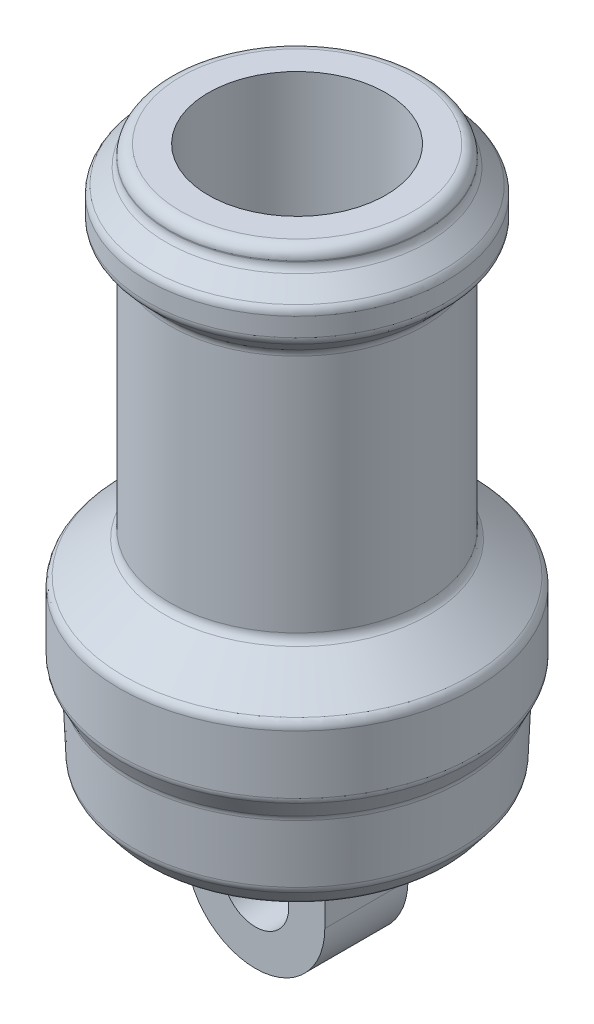
ISO-10303-21;
HEADER;
FILE_DESCRIPTION(('STEP AP214'),'2;1');
FILE_NAME('part.step','',(''),(''),'','','');
FILE_SCHEMA(('AUTOMOTIVE_DESIGN { 1 0 10303 214 1 1 1 1 }'));
ENDSEC;
DATA;
#1=APPLICATION_CONTEXT('core data for automotive mechanical design processes');
#2=APPLICATION_PROTOCOL_DEFINITION('international standard','automotive_design',2000,#1);
#3=PRODUCT_CONTEXT('',#1,'mechanical');
#4=PRODUCT('Part','Part','',(#3));
#5=PRODUCT_RELATED_PRODUCT_CATEGORY('part','',(#4));
#6=PRODUCT_DEFINITION_FORMATION('','',#4);
#7=PRODUCT_DEFINITION_CONTEXT('part definition',#1,'design');
#8=PRODUCT_DEFINITION('design','',#6,#7);
#9=PRODUCT_DEFINITION_SHAPE('','',#8);
#10=(LENGTH_UNIT() NAMED_UNIT(*) SI_UNIT(.MILLI.,.METRE.));
#11=(NAMED_UNIT(*) PLANE_ANGLE_UNIT() SI_UNIT($,.RADIAN.));
#12=(NAMED_UNIT(*) SI_UNIT($,.STERADIAN.) SOLID_ANGLE_UNIT());
#13=UNCERTAINTY_MEASURE_WITH_UNIT(LENGTH_MEASURE(1.E-05),#10,'distance_accuracy_value','');
#14=(GEOMETRIC_REPRESENTATION_CONTEXT(3) GLOBAL_UNCERTAINTY_ASSIGNED_CONTEXT((#13)) GLOBAL_UNIT_ASSIGNED_CONTEXT((#10,
#11,#12)) REPRESENTATION_CONTEXT('',''));
#15=CARTESIAN_POINT('',(0.,0.,0.));
#16=DIRECTION('',(0.,0.,1.));
#17=DIRECTION('',(1.,0.,0.));
#18=AXIS2_PLACEMENT_3D('',#15,#16,#17);
#19=CARTESIAN_POINT('',(-12.5,-75.,7.5));
#20=DIRECTION('',(0.,0.,-1.));
#21=DIRECTION('',(-1.,0.,0.));
#22=AXIS2_PLACEMENT_3D('',#19,#20,#21);
#23=PLANE('',#22);
#24=CARTESIAN_POINT('',(0.,-62.5,7.5));
#25=DIRECTION('',(0.,0.,-1.));
#26=DIRECTION('',(-1.,0.,0.));
#27=AXIS2_PLACEMENT_3D('',#24,#25,#26);
#28=CIRCLE('',#27,6.00000000000001);
#29=CARTESIAN_POINT('',(-6.00000000000001,-62.5,7.5));
#30=VERTEX_POINT('',#29);
#31=EDGE_CURVE('E99',#30,#30,#28,.T.);
#32=ORIENTED_EDGE('',*,*,#31,.T.);
#33=EDGE_LOOP('',(#32));
#34=FACE_BOUND('',#33,.T.);
#35=DIRECTION('',(0.,1.,0.));
#36=VECTOR('',#35,1.);
#37=CARTESIAN_POINT('',(12.5,-75.,7.5));
#38=LINE('',#37,#36);
#39=CARTESIAN_POINT('',(12.5,-62.5,7.5));
#40=VERTEX_POINT('',#39);
#41=CARTESIAN_POINT('',(12.5,-52.,7.5));
#42=VERTEX_POINT('',#41);
#43=EDGE_CURVE('E103',#40,#42,#38,.T.);
#44=ORIENTED_EDGE('',*,*,#43,.T.);
#45=DIRECTION('',(-1.,0.,0.));
#46=VECTOR('',#45,1.);
#47=CARTESIAN_POINT('',(-12.5,-52.,7.5));
#48=LINE('',#47,#46);
#49=CARTESIAN_POINT('',(-12.5,-52.,7.5));
#50=VERTEX_POINT('',#49);
#51=EDGE_CURVE('E134',#42,#50,#48,.T.);
#52=ORIENTED_EDGE('',*,*,#51,.T.);
#53=DIRECTION('',(0.,1.,0.));
#54=VECTOR('',#53,1.);
#55=CARTESIAN_POINT('',(-12.5,-75.,7.5));
#56=LINE('',#55,#54);
#57=CARTESIAN_POINT('',(-12.5,-62.5,7.5));
#58=VERTEX_POINT('',#57);
#59=EDGE_CURVE('E109',#58,#50,#56,.T.);
#60=ORIENTED_EDGE('',*,*,#59,.F.);
#61=CARTESIAN_POINT('',(0.,-62.5,7.5));
#62=DIRECTION('',(0.,0.,-1.));
#63=DIRECTION('',(-1.,0.,0.));
#64=AXIS2_PLACEMENT_3D('',#61,#62,#63);
#65=CIRCLE('',#64,12.5);
#66=EDGE_CURVE('E107',#58,#40,#65,.F.);
#67=ORIENTED_EDGE('',*,*,#66,.T.);
#68=EDGE_LOOP('',(#44,#52,#60,#67));
#69=FACE_BOUND('',#68,.T.);
#70=ADVANCED_FACE('F36',(#34,#69),#23,.F.);
#71=CARTESIAN_POINT('',(-12.5,-75.,-7.5));
#72=DIRECTION('',(0.,0.,1.));
#73=DIRECTION('',(1.,0.,0.));
#74=AXIS2_PLACEMENT_3D('',#71,#72,#73);
#75=PLANE('',#74);
#76=CARTESIAN_POINT('',(0.,-62.5,-7.5));
#77=DIRECTION('',(0.,0.,-1.));
#78=DIRECTION('',(-1.,0.,0.));
#79=AXIS2_PLACEMENT_3D('',#76,#77,#78);
#80=CIRCLE('',#79,6.00000000000001);
#81=CARTESIAN_POINT('',(-6.00000000000001,-62.5,-7.5));
#82=VERTEX_POINT('',#81);
#83=EDGE_CURVE('E149',#82,#82,#80,.T.);
#84=ORIENTED_EDGE('',*,*,#83,.F.);
#85=EDGE_LOOP('',(#84));
#86=FACE_BOUND('',#85,.T.);
#87=DIRECTION('',(0.,1.,0.));
#88=VECTOR('',#87,1.);
#89=CARTESIAN_POINT('',(-12.5,-75.,-7.5));
#90=LINE('',#89,#88);
#91=CARTESIAN_POINT('',(-12.5,-62.5,-7.5));
#92=VERTEX_POINT('',#91);
#93=CARTESIAN_POINT('',(-12.5,-52.,-7.5));
#94=VERTEX_POINT('',#93);
#95=EDGE_CURVE('E106',#92,#94,#90,.T.);
#96=ORIENTED_EDGE('',*,*,#95,.T.);
#97=DIRECTION('',(1.,0.,0.));
#98=VECTOR('',#97,1.);
#99=CARTESIAN_POINT('',(12.5,-52.,-7.5));
#100=LINE('',#99,#98);
#101=CARTESIAN_POINT('',(12.5,-52.,-7.5));
#102=VERTEX_POINT('',#101);
#103=EDGE_CURVE('E51',#94,#102,#100,.T.);
#104=ORIENTED_EDGE('',*,*,#103,.T.);
#105=DIRECTION('',(0.,1.,0.));
#106=VECTOR('',#105,1.);
#107=CARTESIAN_POINT('',(12.5,-75.,-7.5));
#108=LINE('',#107,#106);
#109=CARTESIAN_POINT('',(12.5,-62.5,-7.5));
#110=VERTEX_POINT('',#109);
#111=EDGE_CURVE('E102',#110,#102,#108,.T.);
#112=ORIENTED_EDGE('',*,*,#111,.F.);
#113=CARTESIAN_POINT('',(0.,-62.5,-7.5));
#114=DIRECTION('',(0.,0.,1.));
#115=DIRECTION('',(1.,0.,0.));
#116=AXIS2_PLACEMENT_3D('',#113,#114,#115);
#117=CIRCLE('',#116,12.5);
#118=EDGE_CURVE('E92',#92,#110,#117,.T.);
#119=ORIENTED_EDGE('',*,*,#118,.F.);
#120=EDGE_LOOP('',(#96,#104,#112,#119));
#121=FACE_BOUND('',#120,.T.);
#122=ADVANCED_FACE('F105',(#86,#121),#75,.F.);
#123=CARTESIAN_POINT('',(0.,-50.,0.));
#124=DIRECTION('',(0.,1.,0.));
#125=DIRECTION('',(0.,0.,1.));
#126=AXIS2_PLACEMENT_3D('',#123,#124,#125);
#127=PLANE('',#126);
#128=CARTESIAN_POINT('',(0.,-50.,0.));
#129=DIRECTION('',(0.,1.,0.));
#130=DIRECTION('',(0.,0.,1.));
#131=AXIS2_PLACEMENT_3D('',#128,#129,#130);
#132=CIRCLE('',#131,25.2591487847459);
#133=CARTESIAN_POINT('',(0.,-50.,25.2591487847459));
#134=VERTEX_POINT('',#133);
#135=EDGE_CURVE('E138',#134,#134,#132,.F.);
#136=ORIENTED_EDGE('',*,*,#135,.T.);
#137=EDGE_LOOP('',(#136));
#138=FACE_BOUND('',#137,.T.);
#139=DIRECTION('',(1.,0.,0.));
#140=VECTOR('',#139,1.);
#141=CARTESIAN_POINT('',(-12.5,-50.,-9.5));
#142=LINE('',#141,#140);
#143=CARTESIAN_POINT('',(14.5,-50.,-9.5));
#144=VERTEX_POINT('',#143);
#145=CARTESIAN_POINT('',(-14.5,-50.,-9.5));
#146=VERTEX_POINT('',#145);
#147=EDGE_CURVE('E125',#144,#146,#142,.F.);
#148=ORIENTED_EDGE('',*,*,#147,.T.);
#149=DIRECTION('',(0.,0.,-1.));
#150=VECTOR('',#149,1.);
#151=CARTESIAN_POINT('',(-14.5,-50.,7.5));
#152=LINE('',#151,#150);
#153=CARTESIAN_POINT('',(-14.5,-50.,9.5));
#154=VERTEX_POINT('',#153);
#155=EDGE_CURVE('E131',#146,#154,#152,.F.);
#156=ORIENTED_EDGE('',*,*,#155,.T.);
#157=DIRECTION('',(-1.,0.,0.));
#158=VECTOR('',#157,1.);
#159=CARTESIAN_POINT('',(12.5,-50.,9.5));
#160=LINE('',#159,#158);
#161=CARTESIAN_POINT('',(14.5,-50.,9.5));
#162=VERTEX_POINT('',#161);
#163=EDGE_CURVE('E129',#154,#162,#160,.F.);
#164=ORIENTED_EDGE('',*,*,#163,.T.);
#165=DIRECTION('',(0.,0.,1.));
#166=VECTOR('',#165,1.);
#167=CARTESIAN_POINT('',(14.5,-50.,-7.5));
#168=LINE('',#167,#166);
#169=EDGE_CURVE('E127',#162,#144,#168,.F.);
#170=ORIENTED_EDGE('',*,*,#169,.T.);
#171=EDGE_LOOP('',(#148,#156,#164,#170));
#172=FACE_BOUND('',#171,.T.);
#173=ADVANCED_FACE('F229',(#138,#172),#127,.F.);
#174=CARTESIAN_POINT('',(0.,-45.8822419738754,0.));
#175=DIRECTION('',(0.,1.,0.));
#176=DIRECTION('',(0.,0.,1.));
#177=AXIS2_PLACEMENT_3D('',#174,#175,#176);
#178=CONICAL_SURFACE('',#177,29.4400170830632,0.661043168850687);
#179=CARTESIAN_POINT('',(0.,-49.2278812270298,0.));
#180=DIRECTION('',(0.,-1.,0.));
#181=DIRECTION('',(0.,0.,-1.));
#182=AXIS2_PLACEMENT_3D('',#179,#180,#181);
#183=CIRCLE('',#182,26.8378532194986);
#184=CARTESIAN_POINT('',(0.,-49.2278812270298,-26.8378532194986));
#185=VERTEX_POINT('',#184);
#186=EDGE_CURVE('E155',#185,#185,#183,.F.);
#187=ORIENTED_EDGE('',*,*,#186,.T.);
#188=EDGE_LOOP('',(#187));
#189=FACE_BOUND('',#188,.T.);
#190=CARTESIAN_POINT('',(0.,-46.3878806505428,0.));
#191=DIRECTION('',(0.,-1.,0.));
#192=DIRECTION('',(0.,0.,-1.));
#193=AXIS2_PLACEMENT_3D('',#190,#191,#192);
#194=CIRCLE('',#193,29.0467425567663);
#195=CARTESIAN_POINT('',(0.,-46.3878806505428,-29.0467425567663));
#196=VERTEX_POINT('',#195);
#197=EDGE_CURVE('E152',#196,#196,#194,.T.);
#198=ORIENTED_EDGE('',*,*,#197,.T.);
#199=EDGE_LOOP('',(#198));
#200=FACE_BOUND('',#199,.T.);
#201=ADVANCED_FACE('F284',(#189,#200),#178,.T.);
#202=CARTESIAN_POINT('',(0.,-43.6340465931266,0.));
#203=DIRECTION('',(0.,1.,0.));
#204=DIRECTION('',(0.,0.,1.));
#205=AXIS2_PLACEMENT_3D('',#202,#203,#204);
#206=PLANE('',#205);
#207=CARTESIAN_POINT('',(0.,-43.6340465931266,0.));
#208=DIRECTION('',(0.,-1.,0.));
#209=DIRECTION('',(0.,0.,-1.));
#210=AXIS2_PLACEMENT_3D('',#207,#208,#209);
#211=CIRCLE('',#210,16.);
#212=CARTESIAN_POINT('',(0.,-43.6340465931266,-16.));
#213=VERTEX_POINT('',#212);
#214=EDGE_CURVE('E119',#213,#213,#211,.T.);
#215=ORIENTED_EDGE('',*,*,#214,.F.);
#216=EDGE_LOOP('',(#215));
#217=FACE_BOUND('',#216,.T.);
#218=ADVANCED_FACE('F280',(#217),#206,.T.);
#219=CARTESIAN_POINT('',(0.,-50.,0.));
#220=DIRECTION('',(0.,-1.,0.));
#221=DIRECTION('',(0.,0.,-1.));
#222=AXIS2_PLACEMENT_3D('',#219,#220,#221);
#223=CYLINDRICAL_SURFACE('',#222,16.);
#224=ORIENTED_EDGE('',*,*,#214,.T.);
#225=EDGE_LOOP('',(#224));
#226=FACE_BOUND('',#225,.T.);
#227=CARTESIAN_POINT('',(0.,50.,0.));
#228=DIRECTION('',(0.,-1.,0.));
#229=DIRECTION('',(0.,0.,-1.));
#230=AXIS2_PLACEMENT_3D('',#227,#228,#229);
#231=CIRCLE('',#230,16.);
#232=CARTESIAN_POINT('',(0.,50.,-16.));
#233=VERTEX_POINT('',#232);
#234=EDGE_CURVE('E116',#233,#233,#231,.T.);
#235=ORIENTED_EDGE('',*,*,#234,.F.);
#236=EDGE_LOOP('',(#235));
#237=FACE_BOUND('',#236,.T.);
#238=ADVANCED_FACE('F276',(#226,#237),#223,.F.);
#239=CARTESIAN_POINT('',(0.,50.,0.));
#240=DIRECTION('',(0.,-1.,0.));
#241=DIRECTION('',(0.,0.,-1.));
#242=AXIS2_PLACEMENT_3D('',#239,#240,#241);
#243=PLANE('',#242);
#244=CARTESIAN_POINT('',(0.,50.,0.));
#245=DIRECTION('',(0.,-1.,0.));
#246=DIRECTION('',(0.,0.,-1.));
#247=AXIS2_PLACEMENT_3D('',#244,#245,#246);
#248=CIRCLE('',#247,21.);
#249=CARTESIAN_POINT('',(0.,50.,-21.));
#250=VERTEX_POINT('',#249);
#251=EDGE_CURVE('E206',#250,#250,#248,.F.);
#252=ORIENTED_EDGE('',*,*,#251,.T.);
#253=EDGE_LOOP('',(#252));
#254=FACE_BOUND('',#253,.T.);
#255=ORIENTED_EDGE('',*,*,#234,.T.);
#256=EDGE_LOOP('',(#255));
#257=FACE_BOUND('',#256,.T.);
#258=ADVANCED_FACE('F272',(#254,#257),#243,.F.);
#259=CARTESIAN_POINT('',(0.,-50.,0.));
#260=DIRECTION('',(0.,-1.,0.));
#261=DIRECTION('',(0.,0.,-1.));
#262=AXIS2_PLACEMENT_3D('',#259,#260,#261);
#263=CYLINDRICAL_SURFACE('',#262,23.);
#264=CARTESIAN_POINT('',(0.,48.,0.));
#265=DIRECTION('',(0.,-1.,0.));
#266=DIRECTION('',(0.,0.,-1.));
#267=AXIS2_PLACEMENT_3D('',#264,#265,#266);
#268=CIRCLE('',#267,23.);
#269=CARTESIAN_POINT('',(0.,48.,-23.));
#270=VERTEX_POINT('',#269);
#271=EDGE_CURVE('E203',#270,#270,#268,.T.);
#272=ORIENTED_EDGE('',*,*,#271,.T.);
#273=EDGE_LOOP('',(#272));
#274=FACE_BOUND('',#273,.T.);
#275=CARTESIAN_POINT('',(0.,47.8284271247462,0.));
#276=DIRECTION('',(0.,-1.,0.));
#277=DIRECTION('',(0.,0.,-1.));
#278=AXIS2_PLACEMENT_3D('',#275,#276,#277);
#279=CIRCLE('',#278,23.);
#280=CARTESIAN_POINT('',(0.,47.8284271247462,-23.));
#281=VERTEX_POINT('',#280);
#282=EDGE_CURVE('E191',#281,#281,#279,.F.);
#283=ORIENTED_EDGE('',*,*,#282,.T.);
#284=EDGE_LOOP('',(#283));
#285=FACE_BOUND('',#284,.T.);
#286=ADVANCED_FACE('F268',(#274,#285),#263,.T.);
#287=CARTESIAN_POINT('',(0.,47.,0.));
#288=DIRECTION('',(0.,-1.,0.));
#289=DIRECTION('',(0.,0.,-1.));
#290=AXIS2_PLACEMENT_3D('',#287,#288,#289);
#291=CONICAL_SURFACE('',#290,23.,0.785398163397447);
#292=CARTESIAN_POINT('',(0.,46.4142135623731,0.));
#293=DIRECTION('',(0.,-1.,0.));
#294=DIRECTION('',(0.,0.,-1.));
#295=AXIS2_PLACEMENT_3D('',#292,#293,#294);
#296=CIRCLE('',#295,23.5857864376269);
#297=CARTESIAN_POINT('',(0.,46.4142135623731,-23.5857864376269));
#298=VERTEX_POINT('',#297);
#299=EDGE_CURVE('E188',#298,#298,#296,.T.);
#300=ORIENTED_EDGE('',*,*,#299,.T.);
#301=EDGE_LOOP('',(#300));
#302=FACE_BOUND('',#301,.T.);
#303=CARTESIAN_POINT('',(0.,43.5857864376269,0.));
#304=DIRECTION('',(0.,1.,0.));
#305=DIRECTION('',(0.,0.,1.));
#306=AXIS2_PLACEMENT_3D('',#303,#304,#305);
#307=CIRCLE('',#306,26.4142135623731);
#308=CARTESIAN_POINT('',(0.,43.5857864376269,26.4142135623731));
#309=VERTEX_POINT('',#308);
#310=EDGE_CURVE('E185',#309,#309,#307,.T.);
#311=ORIENTED_EDGE('',*,*,#310,.T.);
#312=EDGE_LOOP('',(#311));
#313=FACE_BOUND('',#312,.T.);
#314=ADVANCED_FACE('F264',(#302,#313),#291,.T.);
#315=CARTESIAN_POINT('',(0.,-50.,0.));
#316=DIRECTION('',(0.,-1.,0.));
#317=DIRECTION('',(0.,0.,-1.));
#318=AXIS2_PLACEMENT_3D('',#315,#316,#317);
#319=CYLINDRICAL_SURFACE('',#318,27.);
#320=CARTESIAN_POINT('',(0.,42.1715728752538,0.));
#321=DIRECTION('',(0.,1.,0.));
#322=DIRECTION('',(0.,0.,1.));
#323=AXIS2_PLACEMENT_3D('',#320,#321,#322);
#324=CIRCLE('',#323,27.);
#325=CARTESIAN_POINT('',(0.,42.1715728752538,27.));
#326=VERTEX_POINT('',#325);
#327=EDGE_CURVE('E197',#326,#326,#324,.F.);
#328=ORIENTED_EDGE('',*,*,#327,.T.);
#329=EDGE_LOOP('',(#328));
#330=FACE_BOUND('',#329,.T.);
#331=CARTESIAN_POINT('',(0.,38.8184996477258,0.));
#332=DIRECTION('',(0.,1.,0.));
#333=DIRECTION('',(0.,0.,1.));
#334=AXIS2_PLACEMENT_3D('',#331,#332,#333);
#335=CIRCLE('',#334,27.);
#336=CARTESIAN_POINT('',(0.,38.8184996477258,27.));
#337=VERTEX_POINT('',#336);
#338=EDGE_CURVE('E194',#337,#337,#335,.T.);
#339=ORIENTED_EDGE('',*,*,#338,.T.);
#340=EDGE_LOOP('',(#339));
#341=FACE_BOUND('',#340,.T.);
#342=ADVANCED_FACE('F260',(#330,#341),#319,.T.);
#343=CARTESIAN_POINT('',(0.,38.,0.));
#344=DIRECTION('',(0.,1.,0.));
#345=DIRECTION('',(0.,0.,1.));
#346=AXIS2_PLACEMENT_3D('',#343,#344,#345);
#347=CONICAL_SURFACE('',#346,27.,0.776909685782056);
#348=CARTESIAN_POINT('',(0.,34.515167739909,0.));
#349=DIRECTION('',(0.,1.,0.));
#350=DIRECTION('',(0.,0.,1.));
#351=AXIS2_PLACEMENT_3D('',#348,#349,#350);
#352=CIRCLE('',#351,23.573833011366);
#353=CARTESIAN_POINT('',(0.,34.515167739909,23.573833011366));
#354=VERTEX_POINT('',#353);
#355=EDGE_CURVE('E11',#354,#354,#352,.T.);
#356=ORIENTED_EDGE('',*,*,#355,.T.);
#357=EDGE_LOOP('',(#356));
#358=FACE_BOUND('',#357,.T.);
#359=CARTESIAN_POINT('',(0.,37.4163414111025,0.));
#360=DIRECTION('',(0.,-1.,0.));
#361=DIRECTION('',(0.,0.,-1.));
#362=AXIS2_PLACEMENT_3D('',#359,#360,#361);
#363=CIRCLE('',#362,26.426166988634);
#364=CARTESIAN_POINT('',(0.,37.4163414111025,-26.426166988634));
#365=VERTEX_POINT('',#364);
#366=EDGE_CURVE('E200',#365,#365,#363,.T.);
#367=ORIENTED_EDGE('',*,*,#366,.T.);
#368=EDGE_LOOP('',(#367));
#369=FACE_BOUND('',#368,.T.);
#370=ADVANCED_FACE('F257',(#358,#369),#347,.T.);
#371=CARTESIAN_POINT('',(0.,-50.,0.));
#372=DIRECTION('',(0.,-1.,0.));
#373=DIRECTION('',(0.,0.,-1.));
#374=AXIS2_PLACEMENT_3D('',#371,#372,#373);
#375=CYLINDRICAL_SURFACE('',#374,23.);
#376=CARTESIAN_POINT('',(0.,33.1130095032857,0.));
#377=DIRECTION('',(0.,-1.,0.));
#378=DIRECTION('',(0.,0.,-1.));
#379=AXIS2_PLACEMENT_3D('',#376,#377,#378);
#380=CIRCLE('',#379,23.);
#381=CARTESIAN_POINT('',(0.,33.1130095032857,-23.));
#382=VERTEX_POINT('',#381);
#383=EDGE_CURVE('E44',#382,#382,#380,.T.);
#384=ORIENTED_EDGE('',*,*,#383,.T.);
#385=EDGE_LOOP('',(#384));
#386=FACE_BOUND('',#385,.T.);
#387=CARTESIAN_POINT('',(0.,-10.0903232376571,0.));
#388=DIRECTION('',(0.,-1.,0.));
#389=DIRECTION('',(0.,0.,-1.));
#390=AXIS2_PLACEMENT_3D('',#387,#388,#389);
#391=CIRCLE('',#390,23.);
#392=CARTESIAN_POINT('',(0.,-10.0903232376571,-23.));
#393=VERTEX_POINT('',#392);
#394=EDGE_CURVE('E182',#393,#393,#391,.F.);
#395=ORIENTED_EDGE('',*,*,#394,.T.);
#396=EDGE_LOOP('',(#395));
#397=FACE_BOUND('',#396,.T.);
#398=ADVANCED_FACE('F211',(#386,#397),#375,.T.);
#399=CARTESIAN_POINT('',(0.,-11.0684908489885,0.));
#400=DIRECTION('',(0.,-1.,0.));
#401=DIRECTION('',(0.,0.,-1.));
#402=AXIS2_PLACEMENT_3D('',#399,#400,#401);
#403=CONICAL_SURFACE('',#402,23.,0.90975315794421);
#404=CARTESIAN_POINT('',(0.,-17.4679540255673,0.));
#405=DIRECTION('',(0.,1.,0.));
#406=DIRECTION('',(0.,0.,1.));
#407=AXIS2_PLACEMENT_3D('',#404,#405,#406);
#408=CIRCLE('',#407,31.2278812270298);
#409=CARTESIAN_POINT('',(0.,-17.4679540255673,31.2278812270298));
#410=VERTEX_POINT('',#409);
#411=EDGE_CURVE('E179',#410,#410,#408,.T.);
#412=ORIENTED_EDGE('',*,*,#411,.T.);
#413=EDGE_LOOP('',(#412));
#414=FACE_BOUND('',#413,.T.);
#415=CARTESIAN_POINT('',(0.,-11.6690276724098,0.));
#416=DIRECTION('',(0.,-1.,0.));
#417=DIRECTION('',(0.,0.,-1.));
#418=AXIS2_PLACEMENT_3D('',#415,#416,#417);
#419=CIRCLE('',#418,23.7721187729702);
#420=CARTESIAN_POINT('',(0.,-11.6690276724098,-23.7721187729702));
#421=VERTEX_POINT('',#420);
#422=EDGE_CURVE('E176',#421,#421,#419,.T.);
#423=ORIENTED_EDGE('',*,*,#422,.T.);
#424=EDGE_LOOP('',(#423));
#425=FACE_BOUND('',#424,.T.);
#426=ADVANCED_FACE('F250',(#414,#425),#403,.T.);
#427=CARTESIAN_POINT('',(0.,-50.,0.));
#428=DIRECTION('',(0.,-1.,0.));
#429=DIRECTION('',(0.,0.,-1.));
#430=AXIS2_PLACEMENT_3D('',#427,#428,#429);
#431=CYLINDRICAL_SURFACE('',#430,32.);
#432=CARTESIAN_POINT('',(0.,-29.5808251476524,0.));
#433=DIRECTION('',(0.,1.,0.));
#434=DIRECTION('',(0.,0.,1.));
#435=AXIS2_PLACEMENT_3D('',#432,#433,#434);
#436=CIRCLE('',#435,32.);
#437=CARTESIAN_POINT('',(0.,-29.5808251476524,32.));
#438=VERTEX_POINT('',#437);
#439=EDGE_CURVE('E173',#438,#438,#436,.T.);
#440=ORIENTED_EDGE('',*,*,#439,.T.);
#441=EDGE_LOOP('',(#440));
#442=FACE_BOUND('',#441,.T.);
#443=CARTESIAN_POINT('',(0.,-19.0466584603199,0.));
#444=DIRECTION('',(0.,1.,0.));
#445=DIRECTION('',(0.,0.,1.));
#446=AXIS2_PLACEMENT_3D('',#443,#444,#445);
#447=CIRCLE('',#446,32.);
#448=CARTESIAN_POINT('',(0.,-19.0466584603199,32.));
#449=VERTEX_POINT('',#448);
#450=EDGE_CURVE('E170',#449,#449,#447,.F.);
#451=ORIENTED_EDGE('',*,*,#450,.T.);
#452=EDGE_LOOP('',(#451));
#453=FACE_BOUND('',#452,.T.);
#454=ADVANCED_FACE('F246',(#442,#453),#431,.T.);
#455=CARTESIAN_POINT('',(0.,-30.0684908489885,0.));
#456=DIRECTION('',(0.,1.,0.));
#457=DIRECTION('',(0.,0.,1.));
#458=AXIS2_PLACEMENT_3D('',#455,#456,#457);
#459=CONICAL_SURFACE('',#458,32.,0.478331835636697);
#460=CARTESIAN_POINT('',(0.,-33.6740431882475,0.));
#461=DIRECTION('',(0.,1.,0.));
#462=DIRECTION('',(0.,0.,1.));
#463=AXIS2_PLACEMENT_3D('',#460,#461,#462);
#464=CIRCLE('',#463,30.1305485660154);
#465=CARTESIAN_POINT('',(0.,-33.6740431882475,30.1305485660154));
#466=VERTEX_POINT('',#465);
#467=EDGE_CURVE('E167',#466,#466,#464,.T.);
#468=ORIENTED_EDGE('',*,*,#467,.T.);
#469=EDGE_LOOP('',(#468));
#470=FACE_BOUND('',#469,.T.);
#471=CARTESIAN_POINT('',(0.,-30.5014229084406,0.));
#472=DIRECTION('',(0.,-1.,0.));
#473=DIRECTION('',(0.,0.,-1.));
#474=AXIS2_PLACEMENT_3D('',#471,#472,#473);
#475=CIRCLE('',#474,31.7755280236684);
#476=CARTESIAN_POINT('',(0.,-30.5014229084406,-31.7755280236684));
#477=VERTEX_POINT('',#476);
#478=EDGE_CURVE('E164',#477,#477,#475,.T.);
#479=ORIENTED_EDGE('',*,*,#478,.T.);
#480=EDGE_LOOP('',(#479));
#481=FACE_BOUND('',#480,.T.);
#482=ADVANCED_FACE('F242',(#470,#481),#459,.T.);
#483=CARTESIAN_POINT('',(0.,-34.0684908489885,0.));
#484=DIRECTION('',(0.,1.,0.));
#485=DIRECTION('',(0.,0.,1.));
#486=AXIS2_PLACEMENT_3D('',#483,#484,#485);
#487=CONICAL_SURFACE('',#486,29.926030457382,0.0411164463940709);
#488=CARTESIAN_POINT('',(0.,-45.2422091482899,0.));
#489=DIRECTION('',(0.,-1.,0.));
#490=DIRECTION('',(0.,0.,-1.));
#491=AXIS2_PLACEMENT_3D('',#488,#489,#490);
#492=CIRCLE('',#491,29.4663477980028);
#493=CARTESIAN_POINT('',(0.,-45.2422091482899,-29.4663477980028));
#494=VERTEX_POINT('',#493);
#495=EDGE_CURVE('E161',#494,#494,#492,.F.);
#496=ORIENTED_EDGE('',*,*,#495,.T.);
#497=EDGE_LOOP('',(#496));
#498=FACE_BOUND('',#497,.T.);
#499=CARTESIAN_POINT('',(0.,-34.5124312242587,0.));
#500=DIRECTION('',(0.,1.,0.));
#501=DIRECTION('',(0.,0.,1.));
#502=AXIS2_PLACEMENT_3D('',#499,#500,#501);
#503=CIRCLE('',#502,29.9077669136946);
#504=CARTESIAN_POINT('',(0.,-34.5124312242587,29.9077669136946));
#505=VERTEX_POINT('',#504);
#506=EDGE_CURVE('E158',#505,#505,#503,.F.);
#507=ORIENTED_EDGE('',*,*,#506,.T.);
#508=EDGE_LOOP('',(#507));
#509=FACE_BOUND('',#508,.T.);
#510=ADVANCED_FACE('F239',(#498,#509),#487,.T.);
#511=CARTESIAN_POINT('',(12.5,-75.,7.5));
#512=DIRECTION('',(-1.,0.,0.));
#513=DIRECTION('',(0.,0.,1.));
#514=AXIS2_PLACEMENT_3D('',#511,#512,#513);
#515=PLANE('',#514);
#516=ORIENTED_EDGE('',*,*,#111,.T.);
#517=DIRECTION('',(0.,0.,1.));
#518=VECTOR('',#517,1.);
#519=CARTESIAN_POINT('',(12.5,-52.,7.5));
#520=LINE('',#519,#518);
#521=EDGE_CURVE('E58',#102,#42,#520,.T.);
#522=ORIENTED_EDGE('',*,*,#521,.T.);
#523=ORIENTED_EDGE('',*,*,#43,.F.);
#524=DIRECTION('',(0.,0.,-1.));
#525=VECTOR('',#524,1.);
#526=CARTESIAN_POINT('',(12.5,-62.5,32.));
#527=LINE('',#526,#525);
#528=EDGE_CURVE('E95',#40,#110,#527,.T.);
#529=ORIENTED_EDGE('',*,*,#528,.T.);
#530=EDGE_LOOP('',(#516,#522,#523,#529));
#531=FACE_BOUND('',#530,.T.);
#532=ADVANCED_FACE('F101',(#531),#515,.F.);
#533=CARTESIAN_POINT('',(-12.5,-75.,7.5));
#534=DIRECTION('',(1.,0.,0.));
#535=DIRECTION('',(0.,0.,-1.));
#536=AXIS2_PLACEMENT_3D('',#533,#534,#535);
#537=PLANE('',#536);
#538=ORIENTED_EDGE('',*,*,#59,.T.);
#539=DIRECTION('',(0.,0.,-1.));
#540=VECTOR('',#539,1.);
#541=CARTESIAN_POINT('',(-12.5,-52.,-7.5));
#542=LINE('',#541,#540);
#543=EDGE_CURVE('E122',#50,#94,#542,.T.);
#544=ORIENTED_EDGE('',*,*,#543,.T.);
#545=ORIENTED_EDGE('',*,*,#95,.F.);
#546=DIRECTION('',(0.,0.,-1.));
#547=VECTOR('',#546,1.);
#548=CARTESIAN_POINT('',(-12.5,-62.5,32.));
#549=LINE('',#548,#547);
#550=EDGE_CURVE('E97',#58,#92,#549,.T.);
#551=ORIENTED_EDGE('',*,*,#550,.F.);
#552=EDGE_LOOP('',(#538,#544,#545,#551));
#553=FACE_BOUND('',#552,.T.);
#554=ADVANCED_FACE('F236',(#553),#537,.F.);
#555=CARTESIAN_POINT('',(0.,-62.5,32.));
#556=DIRECTION('',(0.,0.,-1.));
#557=DIRECTION('',(-1.,0.,0.));
#558=AXIS2_PLACEMENT_3D('',#555,#556,#557);
#559=CYLINDRICAL_SURFACE('',#558,12.5);
#560=ORIENTED_EDGE('',*,*,#550,.T.);
#561=ORIENTED_EDGE('',*,*,#118,.T.);
#562=ORIENTED_EDGE('',*,*,#528,.F.);
#563=ORIENTED_EDGE('',*,*,#66,.F.);
#564=EDGE_LOOP('',(#560,#561,#562,#563));
#565=FACE_BOUND('',#564,.T.);
#566=ADVANCED_FACE('F94',(#565),#559,.T.);
#567=CARTESIAN_POINT('',(0.,-62.5,32.));
#568=DIRECTION('',(0.,0.,-1.));
#569=DIRECTION('',(-1.,0.,0.));
#570=AXIS2_PLACEMENT_3D('',#567,#568,#569);
#571=CYLINDRICAL_SURFACE('',#570,6.00000000000001);
#572=ORIENTED_EDGE('',*,*,#83,.T.);
#573=EDGE_LOOP('',(#572));
#574=FACE_BOUND('',#573,.T.);
#575=ORIENTED_EDGE('',*,*,#31,.F.);
#576=EDGE_LOOP('',(#575));
#577=FACE_BOUND('',#576,.T.);
#578=ADVANCED_FACE('F308',(#574,#577),#571,.F.);
#579=CARTESIAN_POINT('',(14.5,-52.,7.5));
#580=DIRECTION('',(0.,0.,-1.));
#581=DIRECTION('',(-1.,0.,0.));
#582=AXIS2_PLACEMENT_3D('',#579,#580,#581);
#583=CYLINDRICAL_SURFACE('',#582,2.);
#584=CARTESIAN_POINT('',(14.5,-52.,-9.5));
#585=DIRECTION('',(-0.707106781186547,0.,-0.707106781186547));
#586=DIRECTION('',(-0.707106781186547,0.,0.707106781186547));
#587=AXIS2_PLACEMENT_3D('',#584,#585,#586);
#588=ELLIPSE('',#587,2.82842712474619,2.);
#589=EDGE_CURVE('E143',#144,#102,#588,.F.);
#590=ORIENTED_EDGE('',*,*,#589,.F.);
#591=ORIENTED_EDGE('',*,*,#169,.F.);
#592=CARTESIAN_POINT('',(14.5,-52.,9.5));
#593=DIRECTION('',(0.707106781186547,0.,-0.707106781186547));
#594=DIRECTION('',(-0.707106781186547,0.,-0.707106781186547));
#595=AXIS2_PLACEMENT_3D('',#592,#593,#594);
#596=ELLIPSE('',#595,2.82842712474619,2.);
#597=EDGE_CURVE('E146',#42,#162,#596,.T.);
#598=ORIENTED_EDGE('',*,*,#597,.F.);
#599=ORIENTED_EDGE('',*,*,#521,.F.);
#600=EDGE_LOOP('',(#590,#591,#598,#599));
#601=FACE_BOUND('',#600,.T.);
#602=ADVANCED_FACE('F304',(#601),#583,.F.);
#603=CARTESIAN_POINT('',(-12.5,-52.,9.5));
#604=DIRECTION('',(1.,0.,0.));
#605=DIRECTION('',(0.,0.,-1.));
#606=AXIS2_PLACEMENT_3D('',#603,#604,#605);
#607=CYLINDRICAL_SURFACE('',#606,2.);
#608=ORIENTED_EDGE('',*,*,#597,.T.);
#609=ORIENTED_EDGE('',*,*,#163,.F.);
#610=CARTESIAN_POINT('',(-14.5,-52.,9.5));
#611=DIRECTION('',(0.707106781186547,0.,0.707106781186547));
#612=DIRECTION('',(0.707106781186547,0.,-0.707106781186547));
#613=AXIS2_PLACEMENT_3D('',#610,#611,#612);
#614=ELLIPSE('',#613,2.82842712474619,2.);
#615=EDGE_CURVE('E141',#50,#154,#614,.T.);
#616=ORIENTED_EDGE('',*,*,#615,.F.);
#617=ORIENTED_EDGE('',*,*,#51,.F.);
#618=EDGE_LOOP('',(#608,#609,#616,#617));
#619=FACE_BOUND('',#618,.T.);
#620=ADVANCED_FACE('F300',(#619),#607,.F.);
#621=CARTESIAN_POINT('',(-12.5,-52.,-9.5));
#622=DIRECTION('',(-1.,0.,0.));
#623=DIRECTION('',(0.,0.,1.));
#624=AXIS2_PLACEMENT_3D('',#621,#622,#623);
#625=CYLINDRICAL_SURFACE('',#624,2.);
#626=ORIENTED_EDGE('',*,*,#589,.T.);
#627=ORIENTED_EDGE('',*,*,#103,.F.);
#628=CARTESIAN_POINT('',(-14.5,-52.,-9.5));
#629=DIRECTION('',(-0.707106781186547,0.,0.707106781186547));
#630=DIRECTION('',(-0.707106781186547,0.,-0.707106781186547));
#631=AXIS2_PLACEMENT_3D('',#628,#629,#630);
#632=ELLIPSE('',#631,2.82842712474619,2.);
#633=EDGE_CURVE('E139',#146,#94,#632,.F.);
#634=ORIENTED_EDGE('',*,*,#633,.F.);
#635=ORIENTED_EDGE('',*,*,#147,.F.);
#636=EDGE_LOOP('',(#626,#627,#634,#635));
#637=FACE_BOUND('',#636,.T.);
#638=ADVANCED_FACE('F296',(#637),#625,.F.);
#639=CARTESIAN_POINT('',(-14.5,-52.,7.5));
#640=DIRECTION('',(0.,0.,1.));
#641=DIRECTION('',(1.,0.,0.));
#642=AXIS2_PLACEMENT_3D('',#639,#640,#641);
#643=CYLINDRICAL_SURFACE('',#642,2.);
#644=ORIENTED_EDGE('',*,*,#615,.T.);
#645=ORIENTED_EDGE('',*,*,#155,.F.);
#646=ORIENTED_EDGE('',*,*,#633,.T.);
#647=ORIENTED_EDGE('',*,*,#543,.F.);
#648=EDGE_LOOP('',(#644,#645,#646,#647));
#649=FACE_BOUND('',#648,.T.);
#650=ADVANCED_FACE('F292',(#649),#643,.F.);
#651=CARTESIAN_POINT('',(0.,-48.,0.));
#652=DIRECTION('',(0.,1.,0.));
#653=DIRECTION('',(0.,0.,1.));
#654=AXIS2_PLACEMENT_3D('',#651,#652,#653);
#655=TOROIDAL_SURFACE('',#654,25.2591487847459,2.);
#656=ORIENTED_EDGE('',*,*,#186,.F.);
#657=EDGE_LOOP('',(#656));
#658=FACE_BOUND('',#657,.T.);
#659=ORIENTED_EDGE('',*,*,#135,.F.);
#660=EDGE_LOOP('',(#659));
#661=FACE_BOUND('',#660,.T.);
#662=ADVANCED_FACE('F295',(#658,#661),#655,.T.);
#663=CARTESIAN_POINT('',(0.,-45.1599994235129,0.));
#664=DIRECTION('',(0.,1.,0.));
#665=DIRECTION('',(0.,0.,1.));
#666=AXIS2_PLACEMENT_3D('',#663,#664,#665);
#667=TOROIDAL_SURFACE('',#666,27.4680381220136,2.);
#668=ORIENTED_EDGE('',*,*,#495,.F.);
#669=EDGE_LOOP('',(#668));
#670=FACE_BOUND('',#669,.T.);
#671=ORIENTED_EDGE('',*,*,#197,.F.);
#672=EDGE_LOOP('',(#671));
#673=FACE_BOUND('',#672,.T.);
#674=ADVANCED_FACE('F312',(#670,#673),#667,.T.);
#675=CARTESIAN_POINT('',(0.,-34.5946409490357,0.));
#676=DIRECTION('',(0.,-1.,0.));
#677=DIRECTION('',(0.,0.,-1.));
#678=AXIS2_PLACEMENT_3D('',#675,#676,#677);
#679=TOROIDAL_SURFACE('',#678,31.9060765896838,2.);
#680=ORIENTED_EDGE('',*,*,#467,.F.);
#681=EDGE_LOOP('',(#680));
#682=FACE_BOUND('',#681,.T.);
#683=ORIENTED_EDGE('',*,*,#506,.F.);
#684=EDGE_LOOP('',(#683));
#685=FACE_BOUND('',#684,.T.);
#686=ADVANCED_FACE('F316',(#682,#685),#679,.F.);
#687=CARTESIAN_POINT('',(0.,-29.5808251476524,0.));
#688=DIRECTION('',(0.,1.,0.));
#689=DIRECTION('',(0.,0.,1.));
#690=AXIS2_PLACEMENT_3D('',#687,#688,#689);
#691=TOROIDAL_SURFACE('',#690,30.,2.);
#692=ORIENTED_EDGE('',*,*,#439,.F.);
#693=EDGE_LOOP('',(#692));
#694=FACE_BOUND('',#693,.T.);
#695=ORIENTED_EDGE('',*,*,#478,.F.);
#696=EDGE_LOOP('',(#695));
#697=FACE_BOUND('',#696,.T.);
#698=ADVANCED_FACE('F320',(#694,#697),#691,.T.);
#699=CARTESIAN_POINT('',(0.,-19.0466584603199,0.));
#700=DIRECTION('',(0.,1.,0.));
#701=DIRECTION('',(0.,0.,1.));
#702=AXIS2_PLACEMENT_3D('',#699,#700,#701);
#703=TOROIDAL_SURFACE('',#702,30.,2.);
#704=ORIENTED_EDGE('',*,*,#411,.F.);
#705=EDGE_LOOP('',(#704));
#706=FACE_BOUND('',#705,.T.);
#707=ORIENTED_EDGE('',*,*,#450,.F.);
#708=EDGE_LOOP('',(#707));
#709=FACE_BOUND('',#708,.T.);
#710=ADVANCED_FACE('F324',(#706,#709),#703,.T.);
#711=CARTESIAN_POINT('',(0.,-10.0903232376571,0.));
#712=DIRECTION('',(0.,-1.,0.));
#713=DIRECTION('',(0.,0.,-1.));
#714=AXIS2_PLACEMENT_3D('',#711,#712,#713);
#715=TOROIDAL_SURFACE('',#714,25.,2.);
#716=ORIENTED_EDGE('',*,*,#394,.F.);
#717=EDGE_LOOP('',(#716));
#718=FACE_BOUND('',#717,.T.);
#719=ORIENTED_EDGE('',*,*,#422,.F.);
#720=EDGE_LOOP('',(#719));
#721=FACE_BOUND('',#720,.T.);
#722=ADVANCED_FACE('F328',(#718,#721),#715,.F.);
#723=CARTESIAN_POINT('',(0.,47.8284271247462,0.));
#724=DIRECTION('',(0.,-1.,0.));
#725=DIRECTION('',(0.,0.,-1.));
#726=AXIS2_PLACEMENT_3D('',#723,#724,#725);
#727=TOROIDAL_SURFACE('',#726,25.,2.);
#728=ORIENTED_EDGE('',*,*,#282,.F.);
#729=EDGE_LOOP('',(#728));
#730=FACE_BOUND('',#729,.T.);
#731=ORIENTED_EDGE('',*,*,#299,.F.);
#732=EDGE_LOOP('',(#731));
#733=FACE_BOUND('',#732,.T.);
#734=ADVANCED_FACE('F332',(#730,#733),#727,.F.);
#735=CARTESIAN_POINT('',(0.,42.1715728752538,0.));
#736=DIRECTION('',(0.,1.,0.));
#737=DIRECTION('',(0.,0.,1.));
#738=AXIS2_PLACEMENT_3D('',#735,#736,#737);
#739=TOROIDAL_SURFACE('',#738,25.,2.);
#740=ORIENTED_EDGE('',*,*,#310,.F.);
#741=EDGE_LOOP('',(#740));
#742=FACE_BOUND('',#741,.T.);
#743=ORIENTED_EDGE('',*,*,#327,.F.);
#744=EDGE_LOOP('',(#743));
#745=FACE_BOUND('',#744,.T.);
#746=ADVANCED_FACE('F336',(#742,#745),#739,.T.);
#747=CARTESIAN_POINT('',(0.,38.8184996477258,0.));
#748=DIRECTION('',(0.,1.,0.));
#749=DIRECTION('',(0.,0.,1.));
#750=AXIS2_PLACEMENT_3D('',#747,#748,#749);
#751=TOROIDAL_SURFACE('',#750,25.,2.);
#752=ORIENTED_EDGE('',*,*,#338,.F.);
#753=EDGE_LOOP('',(#752));
#754=FACE_BOUND('',#753,.T.);
#755=ORIENTED_EDGE('',*,*,#366,.F.);
#756=EDGE_LOOP('',(#755));
#757=FACE_BOUND('',#756,.T.);
#758=ADVANCED_FACE('F220',(#754,#757),#751,.T.);
#759=CARTESIAN_POINT('',(0.,48.,0.));
#760=DIRECTION('',(0.,-1.,0.));
#761=DIRECTION('',(0.,0.,-1.));
#762=AXIS2_PLACEMENT_3D('',#759,#760,#761);
#763=TOROIDAL_SURFACE('',#762,21.,2.);
#764=ORIENTED_EDGE('',*,*,#251,.F.);
#765=EDGE_LOOP('',(#764));
#766=FACE_BOUND('',#765,.T.);
#767=ORIENTED_EDGE('',*,*,#271,.F.);
#768=EDGE_LOOP('',(#767));
#769=FACE_BOUND('',#768,.T.);
#770=ADVANCED_FACE('F215',(#766,#769),#763,.T.);
#771=CARTESIAN_POINT('',(0.,33.1130095032857,0.));
#772=DIRECTION('',(0.,-1.,0.));
#773=DIRECTION('',(0.,0.,-1.));
#774=AXIS2_PLACEMENT_3D('',#771,#772,#773);
#775=TOROIDAL_SURFACE('',#774,25.,2.);
#776=ORIENTED_EDGE('',*,*,#355,.F.);
#777=EDGE_LOOP('',(#776));
#778=FACE_BOUND('',#777,.T.);
#779=ORIENTED_EDGE('',*,*,#383,.F.);
#780=EDGE_LOOP('',(#779));
#781=FACE_BOUND('',#780,.T.);
#782=ADVANCED_FACE('F38',(#778,#781),#775,.F.);
#783=CLOSED_SHELL('',(#70,#122,#173,#201,#218,#238,#258,#286,#314,#342,#370,#398,#426,#454,#482,
#510,#532,#554,#566,#578,#602,#620,#638,#650,#662,#674,#686,#698,#710,#722,#734,#746,#758,#770,#782));
#784=MANIFOLD_SOLID_BREP('B2',#783);
#785=ADVANCED_BREP_SHAPE_REPRESENTATION('',(#18,#784),#14);
#786=SHAPE_DEFINITION_REPRESENTATION(#9,#785);
ENDSEC;
END-ISO-10303-21;
